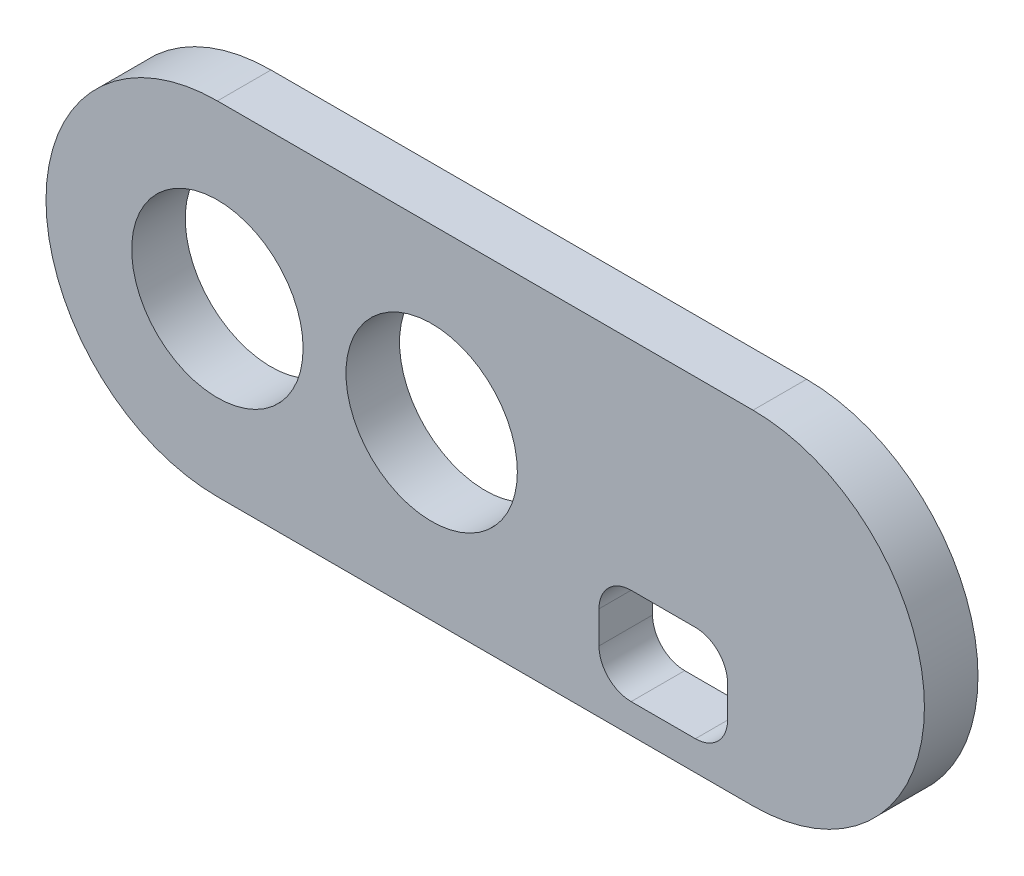
ISO-10303-21;
HEADER;
FILE_DESCRIPTION(('STEP AP214'),'2;1');
FILE_NAME('part.step','',(''),(''),'','','');
FILE_SCHEMA(('AUTOMOTIVE_DESIGN { 1 0 10303 214 1 1 1 1 }'));
ENDSEC;
DATA;
#1=APPLICATION_CONTEXT('core data for automotive mechanical design processes');
#2=APPLICATION_PROTOCOL_DEFINITION('international standard','automotive_design',2000,#1);
#3=PRODUCT_CONTEXT('',#1,'mechanical');
#4=PRODUCT('Part','Part','',(#3));
#5=PRODUCT_RELATED_PRODUCT_CATEGORY('part','',(#4));
#6=PRODUCT_DEFINITION_FORMATION('','',#4);
#7=PRODUCT_DEFINITION_CONTEXT('part definition',#1,'design');
#8=PRODUCT_DEFINITION('design','',#6,#7);
#9=PRODUCT_DEFINITION_SHAPE('','',#8);
#10=(LENGTH_UNIT() NAMED_UNIT(*) SI_UNIT(.MILLI.,.METRE.));
#11=(NAMED_UNIT(*) PLANE_ANGLE_UNIT() SI_UNIT($,.RADIAN.));
#12=(NAMED_UNIT(*) SI_UNIT($,.STERADIAN.) SOLID_ANGLE_UNIT());
#13=UNCERTAINTY_MEASURE_WITH_UNIT(LENGTH_MEASURE(1.E-05),#10,'distance_accuracy_value','');
#14=(GEOMETRIC_REPRESENTATION_CONTEXT(3) GLOBAL_UNCERTAINTY_ASSIGNED_CONTEXT((#13)) GLOBAL_UNIT_ASSIGNED_CONTEXT((#10,
#11,#12)) REPRESENTATION_CONTEXT('',''));
#15=CARTESIAN_POINT('',(0.,0.,0.));
#16=DIRECTION('',(0.,0.,1.));
#17=DIRECTION('',(1.,0.,0.));
#18=AXIS2_PLACEMENT_3D('',#15,#16,#17);
#19=CARTESIAN_POINT('',(28.3509670475891,23.4110769929322,5.));
#20=DIRECTION('',(0.,0.,-1.));
#21=DIRECTION('',(-1.,0.,0.));
#22=AXIS2_PLACEMENT_3D('',#19,#20,#21);
#23=CYLINDRICAL_SURFACE('',#22,16.);
#24=CARTESIAN_POINT('',(28.3509670475891,23.4110769929322,0.));
#25=DIRECTION('',(0.,0.,1.));
#26=DIRECTION('',(1.,0.,0.));
#27=AXIS2_PLACEMENT_3D('',#24,#25,#26);
#28=CIRCLE('',#27,16.);
#29=CARTESIAN_POINT('',(28.3509670475891,7.41107699293217,0.));
#30=VERTEX_POINT('',#29);
#31=CARTESIAN_POINT('',(28.3509670475891,39.4110769929322,0.));
#32=VERTEX_POINT('',#31);
#33=EDGE_CURVE('E422',#30,#32,#28,.T.);
#34=ORIENTED_EDGE('',*,*,#33,.T.);
#35=DIRECTION('',(0.,0.,-1.));
#36=VECTOR('',#35,1.);
#37=CARTESIAN_POINT('',(28.3509670475891,39.4110769929322,5.));
#38=LINE('',#37,#36);
#39=CARTESIAN_POINT('',(28.3509670475891,39.4110769929322,5.));
#40=VERTEX_POINT('',#39);
#41=EDGE_CURVE('E164',#40,#32,#38,.T.);
#42=ORIENTED_EDGE('',*,*,#41,.F.);
#43=CARTESIAN_POINT('',(28.3509670475891,23.4110769929322,5.));
#44=DIRECTION('',(0.,0.,1.));
#45=DIRECTION('',(1.,0.,0.));
#46=AXIS2_PLACEMENT_3D('',#43,#44,#45);
#47=CIRCLE('',#46,16.);
#48=CARTESIAN_POINT('',(28.3509670475891,7.41107699293217,5.));
#49=VERTEX_POINT('',#48);
#50=EDGE_CURVE('E451',#49,#40,#47,.T.);
#51=ORIENTED_EDGE('',*,*,#50,.F.);
#52=DIRECTION('',(0.,0.,-1.));
#53=VECTOR('',#52,1.);
#54=CARTESIAN_POINT('',(28.3509670475891,7.41107699293217,5.));
#55=LINE('',#54,#53);
#56=EDGE_CURVE('E12',#49,#30,#55,.T.);
#57=ORIENTED_EDGE('',*,*,#56,.T.);
#58=EDGE_LOOP('',(#34,#42,#51,#57));
#59=FACE_BOUND('',#58,.T.);
#60=ADVANCED_FACE('F153',(#59),#23,.T.);
#61=CARTESIAN_POINT('',(0.,39.4110769929322,5.));
#62=DIRECTION('',(0.,1.,0.));
#63=DIRECTION('',(-1.,0.,0.));
#64=AXIS2_PLACEMENT_3D('',#61,#62,#63);
#65=PLANE('',#64);
#66=DIRECTION('',(1.,0.,0.));
#67=VECTOR('',#66,1.);
#68=CARTESIAN_POINT('',(0.,39.4110769929322,0.));
#69=LINE('',#68,#67);
#70=CARTESIAN_POINT('',(-21.6490329524109,39.4110769929322,0.));
#71=VERTEX_POINT('',#70);
#72=EDGE_CURVE('E429',#71,#32,#69,.T.);
#73=ORIENTED_EDGE('',*,*,#72,.F.);
#74=DIRECTION('',(0.,0.,-1.));
#75=VECTOR('',#74,1.);
#76=CARTESIAN_POINT('',(-21.6490329524109,39.4110769929322,5.));
#77=LINE('',#76,#75);
#78=CARTESIAN_POINT('',(-21.6490329524109,39.4110769929322,5.));
#79=VERTEX_POINT('',#78);
#80=EDGE_CURVE('E442',#79,#71,#77,.T.);
#81=ORIENTED_EDGE('',*,*,#80,.F.);
#82=DIRECTION('',(1.,0.,0.));
#83=VECTOR('',#82,1.);
#84=CARTESIAN_POINT('',(0.,39.4110769929322,5.));
#85=LINE('',#84,#83);
#86=EDGE_CURVE('E448',#79,#40,#85,.T.);
#87=ORIENTED_EDGE('',*,*,#86,.T.);
#88=ORIENTED_EDGE('',*,*,#41,.T.);
#89=EDGE_LOOP('',(#73,#81,#87,#88));
#90=FACE_BOUND('',#89,.T.);
#91=ADVANCED_FACE('F395',(#90),#65,.T.);
#92=CARTESIAN_POINT('',(-21.6490329524109,23.4110769929322,5.));
#93=DIRECTION('',(0.,0.,-1.));
#94=DIRECTION('',(-1.,0.,0.));
#95=AXIS2_PLACEMENT_3D('',#92,#93,#94);
#96=CYLINDRICAL_SURFACE('',#95,16.);
#97=CARTESIAN_POINT('',(-21.6490329524109,23.4110769929322,0.));
#98=DIRECTION('',(0.,0.,1.));
#99=DIRECTION('',(1.,0.,0.));
#100=AXIS2_PLACEMENT_3D('',#97,#98,#99);
#101=CIRCLE('',#100,16.);
#102=CARTESIAN_POINT('',(-21.6490329524109,7.41107699293217,0.));
#103=VERTEX_POINT('',#102);
#104=EDGE_CURVE('E419',#71,#103,#101,.T.);
#105=ORIENTED_EDGE('',*,*,#104,.T.);
#106=DIRECTION('',(0.,0.,-1.));
#107=VECTOR('',#106,1.);
#108=CARTESIAN_POINT('',(-21.6490329524109,7.41107699293217,5.));
#109=LINE('',#108,#107);
#110=CARTESIAN_POINT('',(-21.6490329524109,7.41107699293217,5.));
#111=VERTEX_POINT('',#110);
#112=EDGE_CURVE('E439',#111,#103,#109,.T.);
#113=ORIENTED_EDGE('',*,*,#112,.F.);
#114=CARTESIAN_POINT('',(-21.6490329524109,23.4110769929322,5.));
#115=DIRECTION('',(0.,0.,1.));
#116=DIRECTION('',(1.,0.,0.));
#117=AXIS2_PLACEMENT_3D('',#114,#115,#116);
#118=CIRCLE('',#117,16.);
#119=EDGE_CURVE('E173',#79,#111,#118,.T.);
#120=ORIENTED_EDGE('',*,*,#119,.F.);
#121=ORIENTED_EDGE('',*,*,#80,.T.);
#122=EDGE_LOOP('',(#105,#113,#120,#121));
#123=FACE_BOUND('',#122,.T.);
#124=ADVANCED_FACE('F391',(#123),#96,.T.);
#125=CARTESIAN_POINT('',(0.,7.41107699293217,5.));
#126=DIRECTION('',(0.,1.,0.));
#127=DIRECTION('',(0.,0.,1.));
#128=AXIS2_PLACEMENT_3D('',#125,#126,#127);
#129=PLANE('',#128);
#130=DIRECTION('',(1.,0.,0.));
#131=VECTOR('',#130,1.);
#132=CARTESIAN_POINT('',(0.,7.41107699293217,0.));
#133=LINE('',#132,#131);
#134=EDGE_CURVE('E417',#103,#30,#133,.T.);
#135=ORIENTED_EDGE('',*,*,#134,.T.);
#136=ORIENTED_EDGE('',*,*,#56,.F.);
#137=DIRECTION('',(1.,0.,0.));
#138=VECTOR('',#137,1.);
#139=CARTESIAN_POINT('',(0.,7.41107699293217,5.));
#140=LINE('',#139,#138);
#141=EDGE_CURVE('E453',#111,#49,#140,.T.);
#142=ORIENTED_EDGE('',*,*,#141,.F.);
#143=ORIENTED_EDGE('',*,*,#112,.T.);
#144=EDGE_LOOP('',(#135,#136,#142,#143));
#145=FACE_BOUND('',#144,.T.);
#146=ADVANCED_FACE('F387',(#145),#129,.F.);
#147=CARTESIAN_POINT('',(-21.6490329524109,23.4110769929322,5.));
#148=DIRECTION('',(0.,0.,-1.));
#149=DIRECTION('',(-1.,0.,0.));
#150=AXIS2_PLACEMENT_3D('',#147,#148,#149);
#151=CYLINDRICAL_SURFACE('',#150,8.);
#152=CARTESIAN_POINT('',(-21.6490329524109,23.4110769929322,5.));
#153=DIRECTION('',(0.,0.,1.));
#154=DIRECTION('',(1.,0.,0.));
#155=AXIS2_PLACEMENT_3D('',#152,#153,#154);
#156=CIRCLE('',#155,8.);
#157=CARTESIAN_POINT('',(-13.6490329524109,23.4110769929322,5.));
#158=VERTEX_POINT('',#157);
#159=EDGE_CURVE('E460',#158,#158,#156,.T.);
#160=ORIENTED_EDGE('',*,*,#159,.T.);
#161=EDGE_LOOP('',(#160));
#162=FACE_BOUND('',#161,.T.);
#163=CARTESIAN_POINT('',(-21.6490329524109,23.4110769929322,0.));
#164=DIRECTION('',(0.,0.,1.));
#165=DIRECTION('',(1.,0.,0.));
#166=AXIS2_PLACEMENT_3D('',#163,#164,#165);
#167=CIRCLE('',#166,8.);
#168=CARTESIAN_POINT('',(-13.6490329524109,23.4110769929322,0.));
#169=VERTEX_POINT('',#168);
#170=EDGE_CURVE('E413',#169,#169,#167,.T.);
#171=ORIENTED_EDGE('',*,*,#170,.F.);
#172=EDGE_LOOP('',(#171));
#173=FACE_BOUND('',#172,.T.);
#174=ADVANCED_FACE('F383',(#162,#173),#151,.F.);
#175=CARTESIAN_POINT('',(-1.64903295241089,23.4110769929322,5.));
#176=DIRECTION('',(0.,0.,-1.));
#177=DIRECTION('',(-1.,0.,0.));
#178=AXIS2_PLACEMENT_3D('',#175,#176,#177);
#179=CYLINDRICAL_SURFACE('',#178,8.);
#180=CARTESIAN_POINT('',(-1.64903295241089,23.4110769929322,5.));
#181=DIRECTION('',(0.,0.,1.));
#182=DIRECTION('',(1.,0.,0.));
#183=AXIS2_PLACEMENT_3D('',#180,#181,#182);
#184=CIRCLE('',#183,8.);
#185=CARTESIAN_POINT('',(6.3509670475891,23.4110769929322,5.));
#186=VERTEX_POINT('',#185);
#187=EDGE_CURVE('E438',#186,#186,#184,.T.);
#188=ORIENTED_EDGE('',*,*,#187,.T.);
#189=EDGE_LOOP('',(#188));
#190=FACE_BOUND('',#189,.T.);
#191=CARTESIAN_POINT('',(-1.64903295241089,23.4110769929322,0.));
#192=DIRECTION('',(0.,0.,1.));
#193=DIRECTION('',(1.,0.,0.));
#194=AXIS2_PLACEMENT_3D('',#191,#192,#193);
#195=CIRCLE('',#194,8.);
#196=CARTESIAN_POINT('',(6.3509670475891,23.4110769929322,0.));
#197=VERTEX_POINT('',#196);
#198=EDGE_CURVE('E320',#197,#197,#195,.T.);
#199=ORIENTED_EDGE('',*,*,#198,.F.);
#200=EDGE_LOOP('',(#199));
#201=FACE_BOUND('',#200,.T.);
#202=ADVANCED_FACE('F380',(#190,#201),#179,.F.);
#203=CARTESIAN_POINT('',(0.,0.,0.));
#204=DIRECTION('',(0.,0.,1.));
#205=DIRECTION('',(1.,0.,0.));
#206=AXIS2_PLACEMENT_3D('',#203,#204,#205);
#207=PLANE('',#206);
#208=ORIENTED_EDGE('',*,*,#198,.T.);
#209=EDGE_LOOP('',(#208));
#210=FACE_BOUND('',#209,.T.);
#211=ORIENTED_EDGE('',*,*,#170,.T.);
#212=EDGE_LOOP('',(#211));
#213=FACE_BOUND('',#212,.T.);
#214=ORIENTED_EDGE('',*,*,#134,.F.);
#215=ORIENTED_EDGE('',*,*,#104,.F.);
#216=ORIENTED_EDGE('',*,*,#72,.T.);
#217=ORIENTED_EDGE('',*,*,#33,.F.);
#218=EDGE_LOOP('',(#214,#215,#216,#217));
#219=FACE_BOUND('',#218,.T.);
#220=CARTESIAN_POINT('',(22.9709576490875,16.161660949554,0.));
#221=DIRECTION('',(0.,0.,1.));
#222=DIRECTION('',(1.,0.,0.));
#223=AXIS2_PLACEMENT_3D('',#220,#221,#222);
#224=CIRCLE('',#223,2.99999999999999);
#225=CARTESIAN_POINT('',(25.9709576490875,16.161660949554,0.));
#226=VERTEX_POINT('',#225);
#227=CARTESIAN_POINT('',(22.9709576490875,19.161660949554,0.));
#228=VERTEX_POINT('',#227);
#229=EDGE_CURVE('E262',#226,#228,#224,.T.);
#230=ORIENTED_EDGE('',*,*,#229,.T.);
#231=DIRECTION('',(1.,0.,0.));
#232=VECTOR('',#231,1.);
#233=CARTESIAN_POINT('',(16.9709576490875,19.161660949554,0.));
#234=LINE('',#233,#232);
#235=CARTESIAN_POINT('',(16.9709576490875,19.161660949554,0.));
#236=VERTEX_POINT('',#235);
#237=EDGE_CURVE('E239',#236,#228,#234,.T.);
#238=ORIENTED_EDGE('',*,*,#237,.F.);
#239=CARTESIAN_POINT('',(16.9709576490875,16.161660949554,0.));
#240=DIRECTION('',(0.,0.,-1.));
#241=DIRECTION('',(-1.,0.,0.));
#242=AXIS2_PLACEMENT_3D('',#239,#240,#241);
#243=CIRCLE('',#242,2.99999999999999);
#244=CARTESIAN_POINT('',(13.9709576490875,16.161660949554,0.));
#245=VERTEX_POINT('',#244);
#246=EDGE_CURVE('E273',#245,#236,#243,.T.);
#247=ORIENTED_EDGE('',*,*,#246,.F.);
#248=DIRECTION('',(0.,-1.,0.));
#249=VECTOR('',#248,1.);
#250=CARTESIAN_POINT('',(13.9709576490875,16.161660949554,0.));
#251=LINE('',#250,#249);
#252=CARTESIAN_POINT('',(13.9709576490875,13.161660949554,0.));
#253=VERTEX_POINT('',#252);
#254=EDGE_CURVE('E310',#245,#253,#251,.T.);
#255=ORIENTED_EDGE('',*,*,#254,.T.);
#256=CARTESIAN_POINT('',(16.9709576490875,13.161660949554,0.));
#257=DIRECTION('',(0.,0.,-1.));
#258=DIRECTION('',(-1.,0.,0.));
#259=AXIS2_PLACEMENT_3D('',#256,#257,#258);
#260=CIRCLE('',#259,2.99999999999999);
#261=CARTESIAN_POINT('',(16.9709576490875,10.1616609495541,0.));
#262=VERTEX_POINT('',#261);
#263=EDGE_CURVE('E306',#262,#253,#260,.T.);
#264=ORIENTED_EDGE('',*,*,#263,.F.);
#265=DIRECTION('',(1.,0.,0.));
#266=VECTOR('',#265,1.);
#267=CARTESIAN_POINT('',(16.9709576490875,10.1616609495541,0.));
#268=LINE('',#267,#266);
#269=CARTESIAN_POINT('',(22.9709576490875,10.1616609495541,0.));
#270=VERTEX_POINT('',#269);
#271=EDGE_CURVE('E302',#262,#270,#268,.T.);
#272=ORIENTED_EDGE('',*,*,#271,.T.);
#273=CARTESIAN_POINT('',(22.9709576490875,13.161660949554,0.));
#274=DIRECTION('',(0.,0.,1.));
#275=DIRECTION('',(1.,0.,0.));
#276=AXIS2_PLACEMENT_3D('',#273,#274,#275);
#277=CIRCLE('',#276,2.99999999999999);
#278=CARTESIAN_POINT('',(25.9709576490875,13.161660949554,0.));
#279=VERTEX_POINT('',#278);
#280=EDGE_CURVE('E298',#270,#279,#277,.T.);
#281=ORIENTED_EDGE('',*,*,#280,.T.);
#282=DIRECTION('',(0.,-1.,0.));
#283=VECTOR('',#282,1.);
#284=CARTESIAN_POINT('',(25.9709576490875,16.161660949554,0.));
#285=LINE('',#284,#283);
#286=EDGE_CURVE('E295',#226,#279,#285,.T.);
#287=ORIENTED_EDGE('',*,*,#286,.F.);
#288=EDGE_LOOP('',(#230,#238,#247,#255,#264,#272,#281,#287));
#289=FACE_BOUND('',#288,.T.);
#290=ADVANCED_FACE('F339',(#210,#213,#219,#289),#207,.F.);
#291=CARTESIAN_POINT('',(0.,0.,5.));
#292=DIRECTION('',(0.,0.,1.));
#293=DIRECTION('',(1.,0.,0.));
#294=AXIS2_PLACEMENT_3D('',#291,#292,#293);
#295=PLANE('',#294);
#296=ORIENTED_EDGE('',*,*,#187,.F.);
#297=EDGE_LOOP('',(#296));
#298=FACE_BOUND('',#297,.T.);
#299=ORIENTED_EDGE('',*,*,#159,.F.);
#300=EDGE_LOOP('',(#299));
#301=FACE_BOUND('',#300,.T.);
#302=ORIENTED_EDGE('',*,*,#141,.T.);
#303=ORIENTED_EDGE('',*,*,#50,.T.);
#304=ORIENTED_EDGE('',*,*,#86,.F.);
#305=ORIENTED_EDGE('',*,*,#119,.T.);
#306=EDGE_LOOP('',(#302,#303,#304,#305));
#307=FACE_BOUND('',#306,.T.);
#308=DIRECTION('',(1.,0.,0.));
#309=VECTOR('',#308,1.);
#310=CARTESIAN_POINT('',(16.9709576490875,19.161660949554,5.));
#311=LINE('',#310,#309);
#312=CARTESIAN_POINT('',(16.9709576490875,19.161660949554,5.));
#313=VERTEX_POINT('',#312);
#314=CARTESIAN_POINT('',(22.9709576490875,19.161660949554,5.));
#315=VERTEX_POINT('',#314);
#316=EDGE_CURVE('E269',#313,#315,#311,.T.);
#317=ORIENTED_EDGE('',*,*,#316,.T.);
#318=CARTESIAN_POINT('',(22.9709576490875,16.161660949554,5.));
#319=DIRECTION('',(0.,0.,1.));
#320=DIRECTION('',(1.,0.,0.));
#321=AXIS2_PLACEMENT_3D('',#318,#319,#320);
#322=CIRCLE('',#321,2.99999999999999);
#323=CARTESIAN_POINT('',(25.9709576490875,16.161660949554,5.));
#324=VERTEX_POINT('',#323);
#325=EDGE_CURVE('E257',#324,#315,#322,.T.);
#326=ORIENTED_EDGE('',*,*,#325,.F.);
#327=DIRECTION('',(0.,-1.,0.));
#328=VECTOR('',#327,1.);
#329=CARTESIAN_POINT('',(25.9709576490875,16.161660949554,5.));
#330=LINE('',#329,#328);
#331=CARTESIAN_POINT('',(25.9709576490875,13.161660949554,5.));
#332=VERTEX_POINT('',#331);
#333=EDGE_CURVE('E245',#324,#332,#330,.T.);
#334=ORIENTED_EDGE('',*,*,#333,.T.);
#335=CARTESIAN_POINT('',(22.9709576490875,13.161660949554,5.));
#336=DIRECTION('',(0.,0.,1.));
#337=DIRECTION('',(1.,0.,0.));
#338=AXIS2_PLACEMENT_3D('',#335,#336,#337);
#339=CIRCLE('',#338,2.99999999999999);
#340=CARTESIAN_POINT('',(22.9709576490875,10.1616609495541,5.));
#341=VERTEX_POINT('',#340);
#342=EDGE_CURVE('E256',#341,#332,#339,.T.);
#343=ORIENTED_EDGE('',*,*,#342,.F.);
#344=DIRECTION('',(1.,0.,0.));
#345=VECTOR('',#344,1.);
#346=CARTESIAN_POINT('',(16.9709576490875,10.1616609495541,5.));
#347=LINE('',#346,#345);
#348=CARTESIAN_POINT('',(16.9709576490875,10.1616609495541,5.));
#349=VERTEX_POINT('',#348);
#350=EDGE_CURVE('E278',#349,#341,#347,.T.);
#351=ORIENTED_EDGE('',*,*,#350,.F.);
#352=CARTESIAN_POINT('',(16.9709576490875,13.161660949554,5.));
#353=DIRECTION('',(0.,0.,-1.));
#354=DIRECTION('',(-1.,0.,0.));
#355=AXIS2_PLACEMENT_3D('',#352,#353,#354);
#356=CIRCLE('',#355,2.99999999999999);
#357=CARTESIAN_POINT('',(13.9709576490875,13.161660949554,5.));
#358=VERTEX_POINT('',#357);
#359=EDGE_CURVE('E281',#349,#358,#356,.T.);
#360=ORIENTED_EDGE('',*,*,#359,.T.);
#361=DIRECTION('',(0.,-1.,0.));
#362=VECTOR('',#361,1.);
#363=CARTESIAN_POINT('',(13.9709576490875,16.161660949554,5.));
#364=LINE('',#363,#362);
#365=CARTESIAN_POINT('',(13.9709576490875,16.161660949554,5.));
#366=VERTEX_POINT('',#365);
#367=EDGE_CURVE('E285',#366,#358,#364,.T.);
#368=ORIENTED_EDGE('',*,*,#367,.F.);
#369=CARTESIAN_POINT('',(16.9709576490875,16.161660949554,5.));
#370=DIRECTION('',(0.,0.,-1.));
#371=DIRECTION('',(-1.,0.,0.));
#372=AXIS2_PLACEMENT_3D('',#369,#370,#371);
#373=CIRCLE('',#372,2.99999999999999);
#374=EDGE_CURVE('E288',#366,#313,#373,.T.);
#375=ORIENTED_EDGE('',*,*,#374,.T.);
#376=EDGE_LOOP('',(#317,#326,#334,#343,#351,#360,#368,#375));
#377=FACE_BOUND('',#376,.T.);
#378=ADVANCED_FACE('F266',(#298,#301,#307,#377),#295,.T.);
#379=CARTESIAN_POINT('',(25.9709576490875,16.161660949554,5.));
#380=DIRECTION('',(1.,0.,0.));
#381=DIRECTION('',(0.,1.,0.));
#382=AXIS2_PLACEMENT_3D('',#379,#380,#381);
#383=PLANE('',#382);
#384=ORIENTED_EDGE('',*,*,#286,.T.);
#385=DIRECTION('',(0.,0.,-1.));
#386=VECTOR('',#385,1.);
#387=CARTESIAN_POINT('',(25.9709576490875,13.161660949554,5.));
#388=LINE('',#387,#386);
#389=EDGE_CURVE('E251',#332,#279,#388,.T.);
#390=ORIENTED_EDGE('',*,*,#389,.F.);
#391=ORIENTED_EDGE('',*,*,#333,.F.);
#392=DIRECTION('',(0.,0.,-1.));
#393=VECTOR('',#392,1.);
#394=CARTESIAN_POINT('',(25.9709576490875,16.161660949554,5.));
#395=LINE('',#394,#393);
#396=EDGE_CURVE('E249',#324,#226,#395,.T.);
#397=ORIENTED_EDGE('',*,*,#396,.T.);
#398=EDGE_LOOP('',(#384,#390,#391,#397));
#399=FACE_BOUND('',#398,.T.);
#400=ADVANCED_FACE('F248',(#399),#383,.F.);
#401=CARTESIAN_POINT('',(22.9709576490875,13.161660949554,5.));
#402=DIRECTION('',(0.,0.,-1.));
#403=DIRECTION('',(-1.,0.,0.));
#404=AXIS2_PLACEMENT_3D('',#401,#402,#403);
#405=CYLINDRICAL_SURFACE('',#404,2.99999999999999);
#406=ORIENTED_EDGE('',*,*,#280,.F.);
#407=DIRECTION('',(0.,0.,-1.));
#408=VECTOR('',#407,1.);
#409=CARTESIAN_POINT('',(22.9709576490875,10.1616609495541,5.));
#410=LINE('',#409,#408);
#411=EDGE_CURVE('E330',#341,#270,#410,.T.);
#412=ORIENTED_EDGE('',*,*,#411,.F.);
#413=ORIENTED_EDGE('',*,*,#342,.T.);
#414=ORIENTED_EDGE('',*,*,#389,.T.);
#415=EDGE_LOOP('',(#406,#412,#413,#414));
#416=FACE_BOUND('',#415,.T.);
#417=ADVANCED_FACE('F336',(#416),#405,.F.);
#418=CARTESIAN_POINT('',(16.9709576490875,10.1616609495541,5.));
#419=DIRECTION('',(0.,1.,0.));
#420=DIRECTION('',(0.,0.,1.));
#421=AXIS2_PLACEMENT_3D('',#418,#419,#420);
#422=PLANE('',#421);
#423=ORIENTED_EDGE('',*,*,#271,.F.);
#424=DIRECTION('',(0.,0.,-1.));
#425=VECTOR('',#424,1.);
#426=CARTESIAN_POINT('',(16.9709576490875,10.1616609495541,5.));
#427=LINE('',#426,#425);
#428=EDGE_CURVE('E327',#349,#262,#427,.T.);
#429=ORIENTED_EDGE('',*,*,#428,.F.);
#430=ORIENTED_EDGE('',*,*,#350,.T.);
#431=ORIENTED_EDGE('',*,*,#411,.T.);
#432=EDGE_LOOP('',(#423,#429,#430,#431));
#433=FACE_BOUND('',#432,.T.);
#434=ADVANCED_FACE('F343',(#433),#422,.T.);
#435=CARTESIAN_POINT('',(16.9709576490875,13.161660949554,5.));
#436=DIRECTION('',(0.,0.,-1.));
#437=DIRECTION('',(-1.,0.,0.));
#438=AXIS2_PLACEMENT_3D('',#435,#436,#437);
#439=CYLINDRICAL_SURFACE('',#438,2.99999999999999);
#440=ORIENTED_EDGE('',*,*,#263,.T.);
#441=DIRECTION('',(0.,0.,-1.));
#442=VECTOR('',#441,1.);
#443=CARTESIAN_POINT('',(13.9709576490875,13.161660949554,5.));
#444=LINE('',#443,#442);
#445=EDGE_CURVE('E324',#358,#253,#444,.T.);
#446=ORIENTED_EDGE('',*,*,#445,.F.);
#447=ORIENTED_EDGE('',*,*,#359,.F.);
#448=ORIENTED_EDGE('',*,*,#428,.T.);
#449=EDGE_LOOP('',(#440,#446,#447,#448));
#450=FACE_BOUND('',#449,.T.);
#451=ADVANCED_FACE('F349',(#450),#439,.F.);
#452=CARTESIAN_POINT('',(13.9709576490875,16.161660949554,5.));
#453=DIRECTION('',(1.,0.,0.));
#454=DIRECTION('',(0.,0.,-1.));
#455=AXIS2_PLACEMENT_3D('',#452,#453,#454);
#456=PLANE('',#455);
#457=ORIENTED_EDGE('',*,*,#254,.F.);
#458=DIRECTION('',(0.,0.,-1.));
#459=VECTOR('',#458,1.);
#460=CARTESIAN_POINT('',(13.9709576490875,16.161660949554,5.));
#461=LINE('',#460,#459);
#462=EDGE_CURVE('E321',#366,#245,#461,.T.);
#463=ORIENTED_EDGE('',*,*,#462,.F.);
#464=ORIENTED_EDGE('',*,*,#367,.T.);
#465=ORIENTED_EDGE('',*,*,#445,.T.);
#466=EDGE_LOOP('',(#457,#463,#464,#465));
#467=FACE_BOUND('',#466,.T.);
#468=ADVANCED_FACE('F352',(#467),#456,.T.);
#469=CARTESIAN_POINT('',(16.9709576490875,16.161660949554,5.));
#470=DIRECTION('',(0.,0.,-1.));
#471=DIRECTION('',(-1.,0.,0.));
#472=AXIS2_PLACEMENT_3D('',#469,#470,#471);
#473=CYLINDRICAL_SURFACE('',#472,2.99999999999999);
#474=ORIENTED_EDGE('',*,*,#246,.T.);
#475=DIRECTION('',(0.,0.,-1.));
#476=VECTOR('',#475,1.);
#477=CARTESIAN_POINT('',(16.9709576490875,19.161660949554,5.));
#478=LINE('',#477,#476);
#479=EDGE_CURVE('E317',#313,#236,#478,.T.);
#480=ORIENTED_EDGE('',*,*,#479,.F.);
#481=ORIENTED_EDGE('',*,*,#374,.F.);
#482=ORIENTED_EDGE('',*,*,#462,.T.);
#483=EDGE_LOOP('',(#474,#480,#481,#482));
#484=FACE_BOUND('',#483,.T.);
#485=ADVANCED_FACE('F356',(#484),#473,.F.);
#486=CARTESIAN_POINT('',(16.9709576490875,19.161660949554,5.));
#487=DIRECTION('',(0.,1.,0.));
#488=DIRECTION('',(0.,0.,1.));
#489=AXIS2_PLACEMENT_3D('',#486,#487,#488);
#490=PLANE('',#489);
#491=ORIENTED_EDGE('',*,*,#237,.T.);
#492=DIRECTION('',(0.,0.,-1.));
#493=VECTOR('',#492,1.);
#494=CARTESIAN_POINT('',(22.9709576490875,19.161660949554,5.));
#495=LINE('',#494,#493);
#496=EDGE_CURVE('E157',#315,#228,#495,.T.);
#497=ORIENTED_EDGE('',*,*,#496,.F.);
#498=ORIENTED_EDGE('',*,*,#316,.F.);
#499=ORIENTED_EDGE('',*,*,#479,.T.);
#500=EDGE_LOOP('',(#491,#497,#498,#499));
#501=FACE_BOUND('',#500,.T.);
#502=ADVANCED_FACE('F155',(#501),#490,.F.);
#503=CARTESIAN_POINT('',(22.9709576490875,16.161660949554,5.));
#504=DIRECTION('',(0.,0.,-1.));
#505=DIRECTION('',(-1.,0.,0.));
#506=AXIS2_PLACEMENT_3D('',#503,#504,#505);
#507=CYLINDRICAL_SURFACE('',#506,2.99999999999999);
#508=ORIENTED_EDGE('',*,*,#229,.F.);
#509=ORIENTED_EDGE('',*,*,#396,.F.);
#510=ORIENTED_EDGE('',*,*,#325,.T.);
#511=ORIENTED_EDGE('',*,*,#496,.T.);
#512=EDGE_LOOP('',(#508,#509,#510,#511));
#513=FACE_BOUND('',#512,.T.);
#514=ADVANCED_FACE('F260',(#513),#507,.F.);
#515=CLOSED_SHELL('',(#60,#91,#124,#146,#174,#202,#290,#378,#400,#417,#434,#451,#468,#485,#502,#514));
#516=MANIFOLD_SOLID_BREP('B2',#515);
#517=ADVANCED_BREP_SHAPE_REPRESENTATION('',(#18,#516),#14);
#518=SHAPE_DEFINITION_REPRESENTATION(#9,#517);
ENDSEC;
END-ISO-10303-21;
